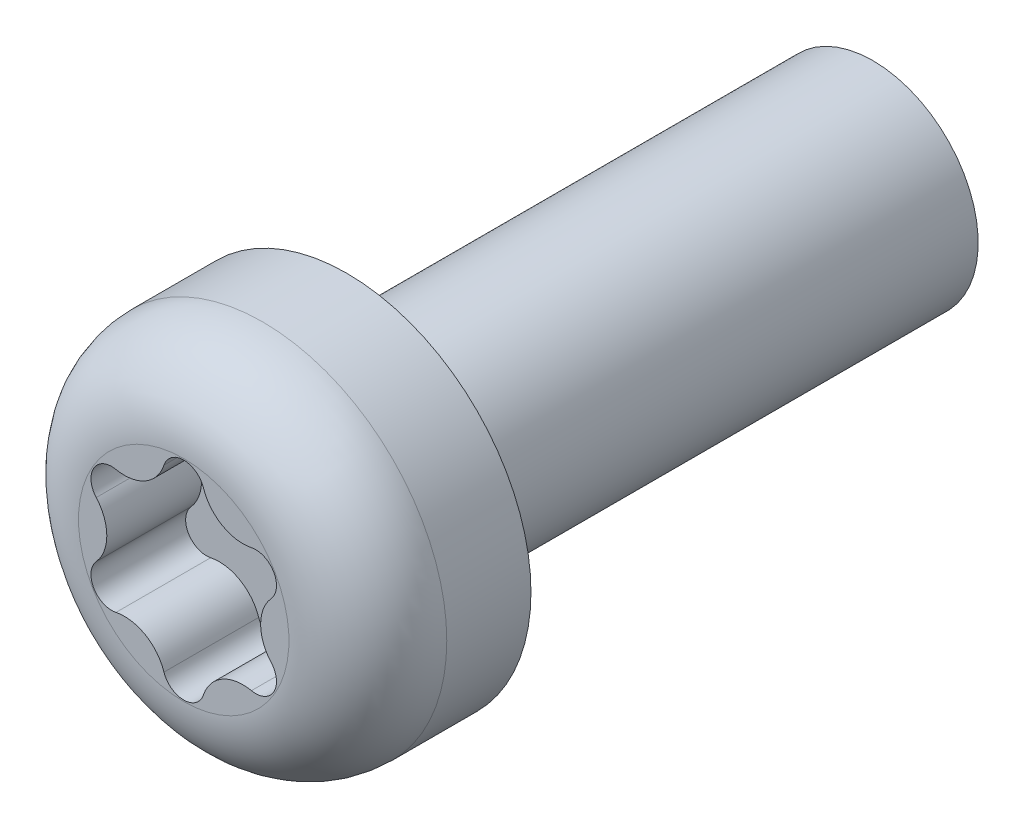
ISO-10303-21;
HEADER;
FILE_DESCRIPTION(('STEP AP214'),'2;1');
FILE_NAME('part.step','',(''),(''),'','','');
FILE_SCHEMA(('AUTOMOTIVE_DESIGN { 1 0 10303 214 1 1 1 1 }'));
ENDSEC;
DATA;
#1=APPLICATION_CONTEXT('core data for automotive mechanical design processes');
#2=APPLICATION_PROTOCOL_DEFINITION('international standard','automotive_design',2000,#1);
#3=PRODUCT_CONTEXT('',#1,'mechanical');
#4=PRODUCT('Part','Part','',(#3));
#5=PRODUCT_RELATED_PRODUCT_CATEGORY('part','',(#4));
#6=PRODUCT_DEFINITION_FORMATION('','',#4);
#7=PRODUCT_DEFINITION_CONTEXT('part definition',#1,'design');
#8=PRODUCT_DEFINITION('design','',#6,#7);
#9=PRODUCT_DEFINITION_SHAPE('','',#8);
#10=(LENGTH_UNIT() NAMED_UNIT(*) SI_UNIT(.MILLI.,.METRE.));
#11=(NAMED_UNIT(*) PLANE_ANGLE_UNIT() SI_UNIT($,.RADIAN.));
#12=(NAMED_UNIT(*) SI_UNIT($,.STERADIAN.) SOLID_ANGLE_UNIT());
#13=UNCERTAINTY_MEASURE_WITH_UNIT(LENGTH_MEASURE(1.E-05),#10,'distance_accuracy_value','');
#14=(GEOMETRIC_REPRESENTATION_CONTEXT(3) GLOBAL_UNCERTAINTY_ASSIGNED_CONTEXT((#13)) GLOBAL_UNIT_ASSIGNED_CONTEXT((#10,
#11,#12)) REPRESENTATION_CONTEXT('',''));
#15=CARTESIAN_POINT('',(0.,0.,0.));
#16=DIRECTION('',(0.,0.,1.));
#17=DIRECTION('',(1.,0.,0.));
#18=AXIS2_PLACEMENT_3D('',#15,#16,#17);
#19=CARTESIAN_POINT('',(0.,2.,-10.));
#20=DIRECTION('',(0.,0.,1.));
#21=DIRECTION('',(0.,-1.,0.));
#22=AXIS2_PLACEMENT_3D('',#19,#20,#21);
#23=PLANE('',#22);
#24=CARTESIAN_POINT('',(0.,0.,-10.));
#25=DIRECTION('',(0.,0.,1.));
#26=DIRECTION('',(0.,-1.,0.));
#27=AXIS2_PLACEMENT_3D('',#24,#25,#26);
#28=CIRCLE('',#27,2.);
#29=CARTESIAN_POINT('',(0.,-2.,-10.));
#30=VERTEX_POINT('',#29);
#31=EDGE_CURVE('E11',#30,#30,#28,.T.);
#32=ORIENTED_EDGE('',*,*,#31,.F.);
#33=EDGE_LOOP('',(#32));
#34=FACE_BOUND('',#33,.T.);
#35=ADVANCED_FACE('F36',(#34),#23,.F.);
#36=CARTESIAN_POINT('',(0.,0.,5.58488227818494));
#37=DIRECTION('',(0.,0.,1.));
#38=DIRECTION('',(0.,-1.,0.));
#39=AXIS2_PLACEMENT_3D('',#36,#37,#38);
#40=CYLINDRICAL_SURFACE('',#39,2.);
#41=CARTESIAN_POINT('',(0.,0.,0.));
#42=DIRECTION('',(0.,0.,1.));
#43=DIRECTION('',(0.,-1.,0.));
#44=AXIS2_PLACEMENT_3D('',#41,#42,#43);
#45=CIRCLE('',#44,2.);
#46=CARTESIAN_POINT('',(0.,-2.,0.));
#47=VERTEX_POINT('',#46);
#48=EDGE_CURVE('E44',#47,#47,#45,.T.);
#49=ORIENTED_EDGE('',*,*,#48,.F.);
#50=EDGE_LOOP('',(#49));
#51=FACE_BOUND('',#50,.T.);
#52=ORIENTED_EDGE('',*,*,#31,.T.);
#53=EDGE_LOOP('',(#52));
#54=FACE_BOUND('',#53,.T.);
#55=ADVANCED_FACE('F145',(#51,#54),#40,.T.);
#56=CARTESIAN_POINT('',(0.,3.5,0.));
#57=DIRECTION('',(0.,0.,1.));
#58=DIRECTION('',(0.,-1.,0.));
#59=AXIS2_PLACEMENT_3D('',#56,#57,#58);
#60=PLANE('',#59);
#61=CARTESIAN_POINT('',(0.,0.,0.));
#62=DIRECTION('',(0.,0.,1.));
#63=DIRECTION('',(0.,-1.,0.));
#64=AXIS2_PLACEMENT_3D('',#61,#62,#63);
#65=CIRCLE('',#64,3.5);
#66=CARTESIAN_POINT('',(0.,-3.5,0.));
#67=VERTEX_POINT('',#66);
#68=EDGE_CURVE('E138',#67,#67,#65,.T.);
#69=ORIENTED_EDGE('',*,*,#68,.F.);
#70=EDGE_LOOP('',(#69));
#71=FACE_BOUND('',#70,.T.);
#72=ORIENTED_EDGE('',*,*,#48,.T.);
#73=EDGE_LOOP('',(#72));
#74=FACE_BOUND('',#73,.T.);
#75=ADVANCED_FACE('F143',(#71,#74),#60,.F.);
#76=CARTESIAN_POINT('',(0.,0.,5.58488227818494));
#77=DIRECTION('',(0.,0.,1.));
#78=DIRECTION('',(0.,-1.,0.));
#79=AXIS2_PLACEMENT_3D('',#76,#77,#78);
#80=CYLINDRICAL_SURFACE('',#79,3.5);
#81=CARTESIAN_POINT('',(0.,0.,1.6));
#82=DIRECTION('',(0.,0.,1.));
#83=DIRECTION('',(0.,-1.,0.));
#84=AXIS2_PLACEMENT_3D('',#81,#82,#83);
#85=CIRCLE('',#84,3.5);
#86=CARTESIAN_POINT('',(0.,-3.5,1.6));
#87=VERTEX_POINT('',#86);
#88=EDGE_CURVE('E135',#87,#87,#85,.T.);
#89=ORIENTED_EDGE('',*,*,#88,.F.);
#90=EDGE_LOOP('',(#89));
#91=FACE_BOUND('',#90,.T.);
#92=ORIENTED_EDGE('',*,*,#68,.T.);
#93=EDGE_LOOP('',(#92));
#94=FACE_BOUND('',#93,.T.);
#95=ADVANCED_FACE('F163',(#91,#94),#80,.T.);
#96=CARTESIAN_POINT('',(0.,0.,1.6));
#97=DIRECTION('',(0.,0.,1.));
#98=DIRECTION('',(0.,-1.,0.));
#99=AXIS2_PLACEMENT_3D('',#96,#97,#98);
#100=TOROIDAL_SURFACE('',#99,2.,1.5);
#101=CARTESIAN_POINT('',(0.,0.,3.1));
#102=DIRECTION('',(0.,0.,1.));
#103=DIRECTION('',(0.,-1.,0.));
#104=AXIS2_PLACEMENT_3D('',#101,#102,#103);
#105=CIRCLE('',#104,2.);
#106=CARTESIAN_POINT('',(0.,-2.,3.1));
#107=VERTEX_POINT('',#106);
#108=EDGE_CURVE('E131',#107,#107,#105,.T.);
#109=ORIENTED_EDGE('',*,*,#108,.F.);
#110=EDGE_LOOP('',(#109));
#111=FACE_BOUND('',#110,.T.);
#112=ORIENTED_EDGE('',*,*,#88,.T.);
#113=EDGE_LOOP('',(#112));
#114=FACE_BOUND('',#113,.T.);
#115=ADVANCED_FACE('F171',(#111,#114),#100,.T.);
#116=CARTESIAN_POINT('',(0.,0.,3.1));
#117=DIRECTION('',(0.,0.,-1.));
#118=DIRECTION('',(0.,1.,0.));
#119=AXIS2_PLACEMENT_3D('',#116,#117,#118);
#120=PLANE('',#119);
#121=CARTESIAN_POINT('',(-1.36832013797942,0.789999999999997,3.1));
#122=DIRECTION('',(0.,0.,1.));
#123=DIRECTION('',(-0.499999999999998,-0.86602540378444,0.));
#124=AXIS2_PLACEMENT_3D('',#121,#122,#123);
#125=CIRCLE('',#124,0.395);
#126=CARTESIAN_POINT('',(-1.28747459016825,1.17663807029199,3.1));
#127=VERTEX_POINT('',#126);
#128=CARTESIAN_POINT('',(-1.66273575501689,0.526666666666665,3.1));
#129=VERTEX_POINT('',#128);
#130=EDGE_CURVE('E95',#127,#129,#125,.T.);
#131=ORIENTED_EDGE('',*,*,#130,.F.);
#132=CARTESIAN_POINT('',(-1.12578349454591,1.94991421087597,3.1));
#133=DIRECTION('',(0.,0.,-1.));
#134=DIRECTION('',(1.,0.,0.));
#135=AXIS2_PLACEMENT_3D('',#132,#133,#134);
#136=CIRCLE('',#135,0.79);
#137=CARTESIAN_POINT('',(-0.375261164848638,1.70330473695866,3.1));
#138=VERTEX_POINT('',#137);
#139=EDGE_CURVE('E90',#138,#127,#136,.T.);
#140=ORIENTED_EDGE('',*,*,#139,.F.);
#141=CARTESIAN_POINT('',(0.,1.58,3.1));
#142=DIRECTION('',(0.,0.,1.));
#143=DIRECTION('',(-1.,0.,0.));
#144=AXIS2_PLACEMENT_3D('',#141,#142,#143);
#145=CIRCLE('',#144,0.395);
#146=CARTESIAN_POINT('',(0.375261164848638,1.70330473695866,3.1));
#147=VERTEX_POINT('',#146);
#148=EDGE_CURVE('E120',#147,#138,#145,.T.);
#149=ORIENTED_EDGE('',*,*,#148,.F.);
#150=CARTESIAN_POINT('',(1.12578349454591,1.94991421087597,3.1));
#151=DIRECTION('',(0.,0.,-1.));
#152=DIRECTION('',(1.,0.,0.));
#153=AXIS2_PLACEMENT_3D('',#150,#151,#152);
#154=CIRCLE('',#153,0.79);
#155=CARTESIAN_POINT('',(1.28747459016824,1.176638070292,3.1));
#156=VERTEX_POINT('',#155);
#157=EDGE_CURVE('E127',#156,#147,#154,.T.);
#158=ORIENTED_EDGE('',*,*,#157,.F.);
#159=CARTESIAN_POINT('',(1.3683201379794,0.790000000000016,3.1));
#160=DIRECTION('',(0.,0.,1.));
#161=DIRECTION('',(-0.50000000000001,0.866025403784433,0.));
#162=AXIS2_PLACEMENT_3D('',#159,#160,#161);
#163=CIRCLE('',#162,0.395);
#164=CARTESIAN_POINT('',(1.66273575501688,0.526666666666688,3.1));
#165=VERTEX_POINT('',#164);
#166=EDGE_CURVE('E353',#165,#156,#163,.T.);
#167=ORIENTED_EDGE('',*,*,#166,.F.);
#168=CARTESIAN_POINT('',(2.25156698909184,0.,3.1));
#169=DIRECTION('',(0.,0.,-1.));
#170=DIRECTION('',(-0.499999999999992,-0.866025403784443,0.));
#171=AXIS2_PLACEMENT_3D('',#168,#169,#170);
#172=CIRCLE('',#171,0.79);
#173=CARTESIAN_POINT('',(1.66273575501689,-0.526666666666654,3.1));
#174=VERTEX_POINT('',#173);
#175=EDGE_CURVE('E371',#174,#165,#172,.T.);
#176=ORIENTED_EDGE('',*,*,#175,.F.);
#177=CARTESIAN_POINT('',(1.36832013797942,-0.789999999999988,3.1));
#178=DIRECTION('',(0.,0.,1.));
#179=DIRECTION('',(0.499999999999992,0.866025403784443,0.));
#180=AXIS2_PLACEMENT_3D('',#177,#178,#179);
#181=CIRCLE('',#180,0.395);
#182=CARTESIAN_POINT('',(1.28747459016826,-1.17663807029198,3.1));
#183=VERTEX_POINT('',#182);
#184=EDGE_CURVE('E377',#183,#174,#181,.T.);
#185=ORIENTED_EDGE('',*,*,#184,.F.);
#186=CARTESIAN_POINT('',(1.12578349454591,-1.94991421087597,3.1));
#187=DIRECTION('',(0.,0.,-1.));
#188=DIRECTION('',(-1.,0.,0.));
#189=AXIS2_PLACEMENT_3D('',#186,#187,#188);
#190=CIRCLE('',#189,0.79);
#191=CARTESIAN_POINT('',(0.375261164848638,-1.70330473695866,3.1));
#192=VERTEX_POINT('',#191);
#193=EDGE_CURVE('E388',#192,#183,#190,.T.);
#194=ORIENTED_EDGE('',*,*,#193,.F.);
#195=CARTESIAN_POINT('',(0.,-1.58,3.1));
#196=DIRECTION('',(0.,0.,1.));
#197=DIRECTION('',(1.,0.,0.));
#198=AXIS2_PLACEMENT_3D('',#195,#196,#197);
#199=CIRCLE('',#198,0.395);
#200=CARTESIAN_POINT('',(-0.375261164848638,-1.70330473695866,3.1));
#201=VERTEX_POINT('',#200);
#202=EDGE_CURVE('E395',#201,#192,#199,.T.);
#203=ORIENTED_EDGE('',*,*,#202,.F.);
#204=CARTESIAN_POINT('',(-1.12578349454591,-1.94991421087597,3.1));
#205=DIRECTION('',(0.,0.,-1.));
#206=DIRECTION('',(-0.500000000000004,0.866025403784436,0.));
#207=AXIS2_PLACEMENT_3D('',#204,#205,#206);
#208=CIRCLE('',#207,0.79);
#209=CARTESIAN_POINT('',(-1.28747459016824,-1.176638070292,3.1));
#210=VERTEX_POINT('',#209);
#211=EDGE_CURVE('E406',#210,#201,#208,.T.);
#212=ORIENTED_EDGE('',*,*,#211,.F.);
#213=CARTESIAN_POINT('',(-1.36832013797941,-0.790000000000007,3.1));
#214=DIRECTION('',(0.,0.,1.));
#215=DIRECTION('',(0.500000000000004,-0.866025403784436,0.));
#216=AXIS2_PLACEMENT_3D('',#213,#214,#215);
#217=CIRCLE('',#216,0.395);
#218=CARTESIAN_POINT('',(-1.66273575501689,-0.526666666666677,3.1));
#219=VERTEX_POINT('',#218);
#220=EDGE_CURVE('E106',#219,#210,#217,.T.);
#221=ORIENTED_EDGE('',*,*,#220,.F.);
#222=CARTESIAN_POINT('',(-2.25156698909184,0.,3.1));
#223=DIRECTION('',(0.,0.,-1.));
#224=DIRECTION('',(0.499999999999998,0.86602540378444,0.));
#225=AXIS2_PLACEMENT_3D('',#222,#223,#224);
#226=CIRCLE('',#225,0.79);
#227=EDGE_CURVE('E85',#129,#219,#226,.T.);
#228=ORIENTED_EDGE('',*,*,#227,.F.);
#229=EDGE_LOOP('',(#131,#140,#149,#158,#167,#176,#185,#194,#203,#212,#221,#228));
#230=FACE_BOUND('',#229,.T.);
#231=ORIENTED_EDGE('',*,*,#108,.T.);
#232=EDGE_LOOP('',(#231));
#233=FACE_BOUND('',#232,.T.);
#234=ADVANCED_FACE('F102',(#230,#233),#120,.F.);
#235=CARTESIAN_POINT('',(-1.12578349454591,1.94991421087597,1.3));
#236=DIRECTION('',(0.,0.,1.));
#237=DIRECTION('',(1.,0.,0.));
#238=AXIS2_PLACEMENT_3D('',#235,#236,#237);
#239=CYLINDRICAL_SURFACE('',#238,0.79);
#240=ORIENTED_EDGE('',*,*,#139,.T.);
#241=DIRECTION('',(0.,0.,1.));
#242=VECTOR('',#241,1.);
#243=CARTESIAN_POINT('',(-1.28747459016825,1.17663807029199,1.3));
#244=LINE('',#243,#242);
#245=CARTESIAN_POINT('',(-1.28747459016825,1.17663807029199,1.3));
#246=VERTEX_POINT('',#245);
#247=EDGE_CURVE('E91',#246,#127,#244,.T.);
#248=ORIENTED_EDGE('',*,*,#247,.F.);
#249=CARTESIAN_POINT('',(-1.12578349454591,1.94991421087597,1.3));
#250=DIRECTION('',(0.,0.,-1.));
#251=DIRECTION('',(1.,0.,0.));
#252=AXIS2_PLACEMENT_3D('',#249,#250,#251);
#253=CIRCLE('',#252,0.79);
#254=CARTESIAN_POINT('',(-0.375261164848638,1.70330473695866,1.3));
#255=VERTEX_POINT('',#254);
#256=EDGE_CURVE('E117',#255,#246,#253,.T.);
#257=ORIENTED_EDGE('',*,*,#256,.F.);
#258=DIRECTION('',(0.,0.,1.));
#259=VECTOR('',#258,1.);
#260=CARTESIAN_POINT('',(-0.375261164848638,1.70330473695866,1.3));
#261=LINE('',#260,#259);
#262=EDGE_CURVE('E52',#255,#138,#261,.T.);
#263=ORIENTED_EDGE('',*,*,#262,.T.);
#264=EDGE_LOOP('',(#240,#248,#257,#263));
#265=FACE_BOUND('',#264,.T.);
#266=ADVANCED_FACE('F187',(#265),#239,.T.);
#267=CARTESIAN_POINT('',(0.,1.58,1.3));
#268=DIRECTION('',(0.,0.,1.));
#269=DIRECTION('',(1.,0.,0.));
#270=AXIS2_PLACEMENT_3D('',#267,#268,#269);
#271=CYLINDRICAL_SURFACE('',#270,0.395);
#272=ORIENTED_EDGE('',*,*,#148,.T.);
#273=ORIENTED_EDGE('',*,*,#262,.F.);
#274=CARTESIAN_POINT('',(0.,1.58,1.3));
#275=DIRECTION('',(0.,0.,1.));
#276=DIRECTION('',(-1.,0.,0.));
#277=AXIS2_PLACEMENT_3D('',#274,#275,#276);
#278=CIRCLE('',#277,0.395);
#279=CARTESIAN_POINT('',(0.375261164848638,1.70330473695866,1.3));
#280=VERTEX_POINT('',#279);
#281=EDGE_CURVE('E123',#280,#255,#278,.T.);
#282=ORIENTED_EDGE('',*,*,#281,.F.);
#283=DIRECTION('',(0.,0.,1.));
#284=VECTOR('',#283,1.);
#285=CARTESIAN_POINT('',(0.375261164848638,1.70330473695866,1.3));
#286=LINE('',#285,#284);
#287=EDGE_CURVE('E60',#280,#147,#286,.T.);
#288=ORIENTED_EDGE('',*,*,#287,.T.);
#289=EDGE_LOOP('',(#272,#273,#282,#288));
#290=FACE_BOUND('',#289,.T.);
#291=ADVANCED_FACE('F194',(#290),#271,.F.);
#292=CARTESIAN_POINT('',(1.12578349454591,1.94991421087597,1.3));
#293=DIRECTION('',(0.,0.,1.));
#294=DIRECTION('',(1.,0.,0.));
#295=AXIS2_PLACEMENT_3D('',#292,#293,#294);
#296=CYLINDRICAL_SURFACE('',#295,0.79);
#297=ORIENTED_EDGE('',*,*,#157,.T.);
#298=ORIENTED_EDGE('',*,*,#287,.F.);
#299=CARTESIAN_POINT('',(1.12578349454591,1.94991421087597,1.3));
#300=DIRECTION('',(0.,0.,-1.));
#301=DIRECTION('',(1.,0.,0.));
#302=AXIS2_PLACEMENT_3D('',#299,#300,#301);
#303=CIRCLE('',#302,0.79);
#304=CARTESIAN_POINT('',(1.28747459016824,1.176638070292,1.3));
#305=VERTEX_POINT('',#304);
#306=EDGE_CURVE('E119',#305,#280,#303,.T.);
#307=ORIENTED_EDGE('',*,*,#306,.F.);
#308=DIRECTION('',(0.,0.,1.));
#309=VECTOR('',#308,1.);
#310=CARTESIAN_POINT('',(1.28747459016824,1.176638070292,1.3));
#311=LINE('',#310,#309);
#312=EDGE_CURVE('E357',#305,#156,#311,.T.);
#313=ORIENTED_EDGE('',*,*,#312,.T.);
#314=EDGE_LOOP('',(#297,#298,#307,#313));
#315=FACE_BOUND('',#314,.T.);
#316=ADVANCED_FACE('F202',(#315),#296,.T.);
#317=CARTESIAN_POINT('',(-1.12578349454591,1.94991421087597,1.3));
#318=DIRECTION('',(0.,0.,1.));
#319=DIRECTION('',(1.,0.,0.));
#320=AXIS2_PLACEMENT_3D('',#317,#318,#319);
#321=PLANE('',#320);
#322=ORIENTED_EDGE('',*,*,#256,.T.);
#323=CARTESIAN_POINT('',(-1.36832013797942,0.789999999999997,1.3));
#324=DIRECTION('',(0.,0.,1.));
#325=DIRECTION('',(-0.499999999999998,-0.86602540378444,0.));
#326=AXIS2_PLACEMENT_3D('',#323,#324,#325);
#327=CIRCLE('',#326,0.395);
#328=CARTESIAN_POINT('',(-1.66273575501689,0.526666666666665,1.3));
#329=VERTEX_POINT('',#328);
#330=EDGE_CURVE('E113',#246,#329,#327,.T.);
#331=ORIENTED_EDGE('',*,*,#330,.T.);
#332=CARTESIAN_POINT('',(-2.25156698909184,0.,1.3));
#333=DIRECTION('',(0.,0.,-1.));
#334=DIRECTION('',(0.499999999999998,0.86602540378444,0.));
#335=AXIS2_PLACEMENT_3D('',#332,#333,#334);
#336=CIRCLE('',#335,0.79);
#337=CARTESIAN_POINT('',(-1.66273575501689,-0.526666666666677,1.3));
#338=VERTEX_POINT('',#337);
#339=EDGE_CURVE('E88',#329,#338,#336,.T.);
#340=ORIENTED_EDGE('',*,*,#339,.T.);
#341=CARTESIAN_POINT('',(-1.36832013797941,-0.790000000000007,1.3));
#342=DIRECTION('',(0.,0.,1.));
#343=DIRECTION('',(0.500000000000004,-0.866025403784436,0.));
#344=AXIS2_PLACEMENT_3D('',#341,#342,#343);
#345=CIRCLE('',#344,0.395);
#346=CARTESIAN_POINT('',(-1.28747459016824,-1.176638070292,1.3));
#347=VERTEX_POINT('',#346);
#348=EDGE_CURVE('E412',#338,#347,#345,.T.);
#349=ORIENTED_EDGE('',*,*,#348,.T.);
#350=CARTESIAN_POINT('',(-1.12578349454591,-1.94991421087597,1.3));
#351=DIRECTION('',(0.,0.,-1.));
#352=DIRECTION('',(-0.500000000000004,0.866025403784436,0.));
#353=AXIS2_PLACEMENT_3D('',#350,#351,#352);
#354=CIRCLE('',#353,0.79);
#355=CARTESIAN_POINT('',(-0.375261164848638,-1.70330473695866,1.3));
#356=VERTEX_POINT('',#355);
#357=EDGE_CURVE('E409',#347,#356,#354,.T.);
#358=ORIENTED_EDGE('',*,*,#357,.T.);
#359=CARTESIAN_POINT('',(0.,-1.58,1.3));
#360=DIRECTION('',(0.,0.,1.));
#361=DIRECTION('',(1.,0.,0.));
#362=AXIS2_PLACEMENT_3D('',#359,#360,#361);
#363=CIRCLE('',#362,0.395);
#364=CARTESIAN_POINT('',(0.375261164848638,-1.70330473695866,1.3));
#365=VERTEX_POINT('',#364);
#366=EDGE_CURVE('E394',#356,#365,#363,.T.);
#367=ORIENTED_EDGE('',*,*,#366,.T.);
#368=CARTESIAN_POINT('',(1.12578349454591,-1.94991421087597,1.3));
#369=DIRECTION('',(0.,0.,-1.));
#370=DIRECTION('',(-1.,0.,0.));
#371=AXIS2_PLACEMENT_3D('',#368,#369,#370);
#372=CIRCLE('',#371,0.79);
#373=CARTESIAN_POINT('',(1.28747459016826,-1.17663807029198,1.3));
#374=VERTEX_POINT('',#373);
#375=EDGE_CURVE('E391',#365,#374,#372,.T.);
#376=ORIENTED_EDGE('',*,*,#375,.T.);
#377=CARTESIAN_POINT('',(1.36832013797942,-0.789999999999988,1.3));
#378=DIRECTION('',(0.,0.,1.));
#379=DIRECTION('',(0.499999999999992,0.866025403784443,0.));
#380=AXIS2_PLACEMENT_3D('',#377,#378,#379);
#381=CIRCLE('',#380,0.395);
#382=CARTESIAN_POINT('',(1.66273575501689,-0.526666666666654,1.3));
#383=VERTEX_POINT('',#382);
#384=EDGE_CURVE('E376',#374,#383,#381,.T.);
#385=ORIENTED_EDGE('',*,*,#384,.T.);
#386=CARTESIAN_POINT('',(2.25156698909184,0.,1.3));
#387=DIRECTION('',(0.,0.,-1.));
#388=DIRECTION('',(-0.499999999999992,-0.866025403784443,0.));
#389=AXIS2_PLACEMENT_3D('',#386,#387,#388);
#390=CIRCLE('',#389,0.79);
#391=CARTESIAN_POINT('',(1.66273575501688,0.526666666666688,1.3));
#392=VERTEX_POINT('',#391);
#393=EDGE_CURVE('E373',#383,#392,#390,.T.);
#394=ORIENTED_EDGE('',*,*,#393,.T.);
#395=CARTESIAN_POINT('',(1.3683201379794,0.790000000000016,1.3));
#396=DIRECTION('',(0.,0.,1.));
#397=DIRECTION('',(-0.50000000000001,0.866025403784433,0.));
#398=AXIS2_PLACEMENT_3D('',#395,#396,#397);
#399=CIRCLE('',#398,0.395);
#400=EDGE_CURVE('E366',#392,#305,#399,.T.);
#401=ORIENTED_EDGE('',*,*,#400,.T.);
#402=ORIENTED_EDGE('',*,*,#306,.T.);
#403=ORIENTED_EDGE('',*,*,#281,.T.);
#404=EDGE_LOOP('',(#322,#331,#340,#349,#358,#367,#376,#385,#394,#401,#402,#403));
#405=FACE_BOUND('',#404,.T.);
#406=ADVANCED_FACE('F208',(#405),#321,.T.);
#407=CARTESIAN_POINT('',(-2.25156698909184,0.,1.3));
#408=DIRECTION('',(0.,0.,1.));
#409=DIRECTION('',(1.,0.,0.));
#410=AXIS2_PLACEMENT_3D('',#407,#408,#409);
#411=CYLINDRICAL_SURFACE('',#410,0.79);
#412=ORIENTED_EDGE('',*,*,#227,.T.);
#413=DIRECTION('',(0.,0.,1.));
#414=VECTOR('',#413,1.);
#415=CARTESIAN_POINT('',(-1.66273575501689,-0.526666666666677,1.3));
#416=LINE('',#415,#414);
#417=EDGE_CURVE('E110',#338,#219,#416,.T.);
#418=ORIENTED_EDGE('',*,*,#417,.F.);
#419=ORIENTED_EDGE('',*,*,#339,.F.);
#420=DIRECTION('',(0.,0.,1.));
#421=VECTOR('',#420,1.);
#422=CARTESIAN_POINT('',(-1.66273575501689,0.526666666666665,1.3));
#423=LINE('',#422,#421);
#424=EDGE_CURVE('E69',#329,#129,#423,.T.);
#425=ORIENTED_EDGE('',*,*,#424,.T.);
#426=EDGE_LOOP('',(#412,#418,#419,#425));
#427=FACE_BOUND('',#426,.T.);
#428=ADVANCED_FACE('F81',(#427),#411,.T.);
#429=CARTESIAN_POINT('',(-1.36832013797942,0.789999999999997,1.3));
#430=DIRECTION('',(0.,0.,1.));
#431=DIRECTION('',(1.,0.,0.));
#432=AXIS2_PLACEMENT_3D('',#429,#430,#431);
#433=CYLINDRICAL_SURFACE('',#432,0.395);
#434=ORIENTED_EDGE('',*,*,#130,.T.);
#435=ORIENTED_EDGE('',*,*,#424,.F.);
#436=ORIENTED_EDGE('',*,*,#330,.F.);
#437=ORIENTED_EDGE('',*,*,#247,.T.);
#438=EDGE_LOOP('',(#434,#435,#436,#437));
#439=FACE_BOUND('',#438,.T.);
#440=ADVANCED_FACE('F96',(#439),#433,.F.);
#441=CARTESIAN_POINT('',(-1.12578349454591,-1.94991421087597,1.3));
#442=DIRECTION('',(0.,0.,1.));
#443=DIRECTION('',(0.,-1.,0.));
#444=AXIS2_PLACEMENT_3D('',#441,#442,#443);
#445=CYLINDRICAL_SURFACE('',#444,0.79);
#446=ORIENTED_EDGE('',*,*,#211,.T.);
#447=DIRECTION('',(0.,0.,1.));
#448=VECTOR('',#447,1.);
#449=CARTESIAN_POINT('',(-0.375261164848638,-1.70330473695866,1.3));
#450=LINE('',#449,#448);
#451=EDGE_CURVE('E398',#356,#201,#450,.T.);
#452=ORIENTED_EDGE('',*,*,#451,.F.);
#453=ORIENTED_EDGE('',*,*,#357,.F.);
#454=DIRECTION('',(0.,0.,1.));
#455=VECTOR('',#454,1.);
#456=CARTESIAN_POINT('',(-1.28747459016824,-1.176638070292,1.3));
#457=LINE('',#456,#455);
#458=EDGE_CURVE('E107',#347,#210,#457,.T.);
#459=ORIENTED_EDGE('',*,*,#458,.T.);
#460=EDGE_LOOP('',(#446,#452,#453,#459));
#461=FACE_BOUND('',#460,.T.);
#462=ADVANCED_FACE('F229',(#461),#445,.T.);
#463=CARTESIAN_POINT('',(-1.36832013797941,-0.790000000000007,1.3));
#464=DIRECTION('',(0.,0.,1.));
#465=DIRECTION('',(0.,-1.,0.));
#466=AXIS2_PLACEMENT_3D('',#463,#464,#465);
#467=CYLINDRICAL_SURFACE('',#466,0.395);
#468=ORIENTED_EDGE('',*,*,#220,.T.);
#469=ORIENTED_EDGE('',*,*,#458,.F.);
#470=ORIENTED_EDGE('',*,*,#348,.F.);
#471=ORIENTED_EDGE('',*,*,#417,.T.);
#472=EDGE_LOOP('',(#468,#469,#470,#471));
#473=FACE_BOUND('',#472,.T.);
#474=ADVANCED_FACE('F236',(#473),#467,.F.);
#475=CARTESIAN_POINT('',(1.12578349454591,-1.94991421087597,1.3));
#476=DIRECTION('',(0.,0.,1.));
#477=DIRECTION('',(0.,-1.,0.));
#478=AXIS2_PLACEMENT_3D('',#475,#476,#477);
#479=CYLINDRICAL_SURFACE('',#478,0.79);
#480=ORIENTED_EDGE('',*,*,#193,.T.);
#481=DIRECTION('',(0.,0.,1.));
#482=VECTOR('',#481,1.);
#483=CARTESIAN_POINT('',(1.28747459016826,-1.17663807029198,1.3));
#484=LINE('',#483,#482);
#485=EDGE_CURVE('E380',#374,#183,#484,.T.);
#486=ORIENTED_EDGE('',*,*,#485,.F.);
#487=ORIENTED_EDGE('',*,*,#375,.F.);
#488=DIRECTION('',(0.,0.,1.));
#489=VECTOR('',#488,1.);
#490=CARTESIAN_POINT('',(0.375261164848638,-1.70330473695866,1.3));
#491=LINE('',#490,#489);
#492=EDGE_CURVE('E403',#365,#192,#491,.T.);
#493=ORIENTED_EDGE('',*,*,#492,.T.);
#494=EDGE_LOOP('',(#480,#486,#487,#493));
#495=FACE_BOUND('',#494,.T.);
#496=ADVANCED_FACE('F244',(#495),#479,.T.);
#497=CARTESIAN_POINT('',(0.,-1.58,1.3));
#498=DIRECTION('',(0.,0.,1.));
#499=DIRECTION('',(0.,-1.,0.));
#500=AXIS2_PLACEMENT_3D('',#497,#498,#499);
#501=CYLINDRICAL_SURFACE('',#500,0.395);
#502=ORIENTED_EDGE('',*,*,#202,.T.);
#503=ORIENTED_EDGE('',*,*,#492,.F.);
#504=ORIENTED_EDGE('',*,*,#366,.F.);
#505=ORIENTED_EDGE('',*,*,#451,.T.);
#506=EDGE_LOOP('',(#502,#503,#504,#505));
#507=FACE_BOUND('',#506,.T.);
#508=ADVANCED_FACE('F252',(#507),#501,.F.);
#509=CARTESIAN_POINT('',(2.25156698909184,0.,1.3));
#510=DIRECTION('',(0.,0.,1.));
#511=DIRECTION('',(0.,-1.,0.));
#512=AXIS2_PLACEMENT_3D('',#509,#510,#511);
#513=CYLINDRICAL_SURFACE('',#512,0.79);
#514=ORIENTED_EDGE('',*,*,#175,.T.);
#515=DIRECTION('',(0.,0.,1.));
#516=VECTOR('',#515,1.);
#517=CARTESIAN_POINT('',(1.66273575501688,0.526666666666688,1.3));
#518=LINE('',#517,#516);
#519=EDGE_CURVE('E361',#392,#165,#518,.T.);
#520=ORIENTED_EDGE('',*,*,#519,.F.);
#521=ORIENTED_EDGE('',*,*,#393,.F.);
#522=DIRECTION('',(0.,0.,1.));
#523=VECTOR('',#522,1.);
#524=CARTESIAN_POINT('',(1.66273575501689,-0.526666666666654,1.3));
#525=LINE('',#524,#523);
#526=EDGE_CURVE('E385',#383,#174,#525,.T.);
#527=ORIENTED_EDGE('',*,*,#526,.T.);
#528=EDGE_LOOP('',(#514,#520,#521,#527));
#529=FACE_BOUND('',#528,.T.);
#530=ADVANCED_FACE('F260',(#529),#513,.T.);
#531=CARTESIAN_POINT('',(1.36832013797942,-0.789999999999988,1.3));
#532=DIRECTION('',(0.,0.,1.));
#533=DIRECTION('',(0.,-1.,0.));
#534=AXIS2_PLACEMENT_3D('',#531,#532,#533);
#535=CYLINDRICAL_SURFACE('',#534,0.395);
#536=ORIENTED_EDGE('',*,*,#184,.T.);
#537=ORIENTED_EDGE('',*,*,#526,.F.);
#538=ORIENTED_EDGE('',*,*,#384,.F.);
#539=ORIENTED_EDGE('',*,*,#485,.T.);
#540=EDGE_LOOP('',(#536,#537,#538,#539));
#541=FACE_BOUND('',#540,.T.);
#542=ADVANCED_FACE('F268',(#541),#535,.F.);
#543=CARTESIAN_POINT('',(1.3683201379794,0.790000000000016,1.3));
#544=DIRECTION('',(0.,0.,1.));
#545=DIRECTION('',(1.,0.,0.));
#546=AXIS2_PLACEMENT_3D('',#543,#544,#545);
#547=CYLINDRICAL_SURFACE('',#546,0.395);
#548=ORIENTED_EDGE('',*,*,#166,.T.);
#549=ORIENTED_EDGE('',*,*,#312,.F.);
#550=ORIENTED_EDGE('',*,*,#400,.F.);
#551=ORIENTED_EDGE('',*,*,#519,.T.);
#552=EDGE_LOOP('',(#548,#549,#550,#551));
#553=FACE_BOUND('',#552,.T.);
#554=ADVANCED_FACE('F276',(#553),#547,.F.);
#555=CLOSED_SHELL('',(#35,#55,#75,#95,#115,#234,#266,#291,#316,#406,#428,#440,#462,#474,#496,
#508,#530,#542,#554));
#556=MANIFOLD_SOLID_BREP('B2',#555);
#557=ADVANCED_BREP_SHAPE_REPRESENTATION('',(#18,#556),#14);
#558=SHAPE_DEFINITION_REPRESENTATION(#9,#557);
ENDSEC;
END-ISO-10303-21;
